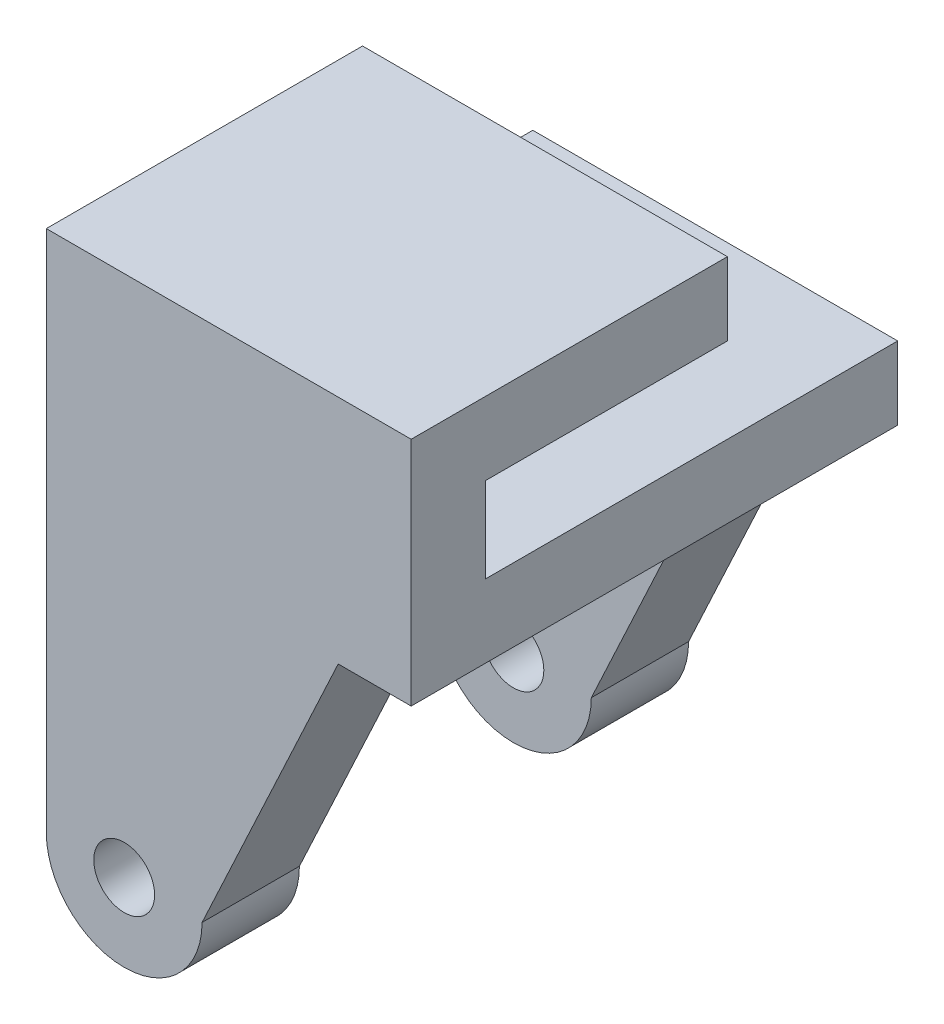
ISO-10303-21;
HEADER;
FILE_DESCRIPTION(('STEP AP214'),'2;1');
FILE_NAME('part.step','',(''),(''),'','','');
FILE_SCHEMA(('AUTOMOTIVE_DESIGN { 1 0 10303 214 1 1 1 1 }'));
ENDSEC;
DATA;
#1=APPLICATION_CONTEXT('core data for automotive mechanical design processes');
#2=APPLICATION_PROTOCOL_DEFINITION('international standard','automotive_design',2000,#1);
#3=PRODUCT_CONTEXT('',#1,'mechanical');
#4=PRODUCT('Part','Part','',(#3));
#5=PRODUCT_RELATED_PRODUCT_CATEGORY('part','',(#4));
#6=PRODUCT_DEFINITION_FORMATION('','',#4);
#7=PRODUCT_DEFINITION_CONTEXT('part definition',#1,'design');
#8=PRODUCT_DEFINITION('design','',#6,#7);
#9=PRODUCT_DEFINITION_SHAPE('','',#8);
#10=(LENGTH_UNIT() NAMED_UNIT(*) SI_UNIT(.MILLI.,.METRE.));
#11=(NAMED_UNIT(*) PLANE_ANGLE_UNIT() SI_UNIT($,.RADIAN.));
#12=(NAMED_UNIT(*) SI_UNIT($,.STERADIAN.) SOLID_ANGLE_UNIT());
#13=UNCERTAINTY_MEASURE_WITH_UNIT(LENGTH_MEASURE(1.E-05),#10,'distance_accuracy_value','');
#14=(GEOMETRIC_REPRESENTATION_CONTEXT(3) GLOBAL_UNCERTAINTY_ASSIGNED_CONTEXT((#13)) GLOBAL_UNIT_ASSIGNED_CONTEXT((#10,
#11,#12)) REPRESENTATION_CONTEXT('',''));
#15=CARTESIAN_POINT('',(0.,0.,0.));
#16=DIRECTION('',(0.,0.,1.));
#17=DIRECTION('',(1.,0.,0.));
#18=AXIS2_PLACEMENT_3D('',#15,#16,#17);
#19=CARTESIAN_POINT('',(15.,0.,0.));
#20=DIRECTION('',(0.,1.,0.));
#21=DIRECTION('',(0.,0.,1.));
#22=AXIS2_PLACEMENT_3D('',#19,#20,#21);
#23=PLANE('',#22);
#24=DIRECTION('',(-1.,0.,0.));
#25=VECTOR('',#24,1.);
#26=CARTESIAN_POINT('',(0.,0.,-16.));
#27=LINE('',#26,#25);
#28=CARTESIAN_POINT('',(12.,0.,-16.));
#29=VERTEX_POINT('',#28);
#30=CARTESIAN_POINT('',(0.,0.,-16.));
#31=VERTEX_POINT('',#30);
#32=EDGE_CURVE('E57',#29,#31,#27,.T.);
#33=ORIENTED_EDGE('',*,*,#32,.F.);
#34=DIRECTION('',(0.,0.,-1.));
#35=VECTOR('',#34,1.);
#36=CARTESIAN_POINT('',(12.,0.,-16.));
#37=LINE('',#36,#35);
#38=CARTESIAN_POINT('',(12.,0.,-20.));
#39=VERTEX_POINT('',#38);
#40=EDGE_CURVE('E62',#29,#39,#37,.T.);
#41=ORIENTED_EDGE('',*,*,#40,.T.);
#42=DIRECTION('',(-1.,0.,0.));
#43=VECTOR('',#42,1.);
#44=CARTESIAN_POINT('',(15.,0.,-20.));
#45=LINE('',#44,#43);
#46=CARTESIAN_POINT('',(15.,0.,-20.));
#47=VERTEX_POINT('',#46);
#48=EDGE_CURVE('E49',#47,#39,#45,.T.);
#49=ORIENTED_EDGE('',*,*,#48,.F.);
#50=DIRECTION('',(0.,0.,-1.));
#51=VECTOR('',#50,1.);
#52=CARTESIAN_POINT('',(15.,0.,0.));
#53=LINE('',#52,#51);
#54=CARTESIAN_POINT('',(15.,0.,0.));
#55=VERTEX_POINT('',#54);
#56=EDGE_CURVE('E292',#55,#47,#53,.T.);
#57=ORIENTED_EDGE('',*,*,#56,.F.);
#58=DIRECTION('',(-1.,0.,0.));
#59=VECTOR('',#58,1.);
#60=CARTESIAN_POINT('',(15.,0.,0.));
#61=LINE('',#60,#59);
#62=CARTESIAN_POINT('',(12.,0.,0.));
#63=VERTEX_POINT('',#62);
#64=EDGE_CURVE('E11',#55,#63,#61,.T.);
#65=ORIENTED_EDGE('',*,*,#64,.T.);
#66=DIRECTION('',(0.,0.,1.));
#67=VECTOR('',#66,1.);
#68=CARTESIAN_POINT('',(12.,0.,-4.));
#69=LINE('',#68,#67);
#70=CARTESIAN_POINT('',(12.,0.,-4.));
#71=VERTEX_POINT('',#70);
#72=EDGE_CURVE('E218',#71,#63,#69,.T.);
#73=ORIENTED_EDGE('',*,*,#72,.F.);
#74=DIRECTION('',(-1.,0.,0.));
#75=VECTOR('',#74,1.);
#76=CARTESIAN_POINT('',(0.,0.,-4.));
#77=LINE('',#76,#75);
#78=CARTESIAN_POINT('',(0.,0.,-4.));
#79=VERTEX_POINT('',#78);
#80=EDGE_CURVE('E194',#71,#79,#77,.T.);
#81=ORIENTED_EDGE('',*,*,#80,.T.);
#82=DIRECTION('',(0.,0.,-1.));
#83=VECTOR('',#82,1.);
#84=CARTESIAN_POINT('',(0.,0.,0.));
#85=LINE('',#84,#83);
#86=EDGE_CURVE('E284',#79,#31,#85,.T.);
#87=ORIENTED_EDGE('',*,*,#86,.T.);
#88=EDGE_LOOP('',(#33,#41,#49,#57,#65,#73,#81,#87));
#89=FACE_BOUND('',#88,.T.);
#90=ADVANCED_FACE('F39',(#89),#23,.F.);
#91=CARTESIAN_POINT('',(15.,0.,0.));
#92=DIRECTION('',(0.,0.,1.));
#93=DIRECTION('',(1.,0.,0.));
#94=AXIS2_PLACEMENT_3D('',#91,#92,#93);
#95=PLANE('',#94);
#96=DIRECTION('',(0.,1.,0.));
#97=VECTOR('',#96,1.);
#98=CARTESIAN_POINT('',(0.,0.,0.));
#99=LINE('',#98,#97);
#100=CARTESIAN_POINT('',(0.,-12.,0.));
#101=VERTEX_POINT('',#100);
#102=CARTESIAN_POINT('',(0.,9.5,0.));
#103=VERTEX_POINT('',#102);
#104=EDGE_CURVE('E278',#101,#103,#99,.T.);
#105=ORIENTED_EDGE('',*,*,#104,.F.);
#106=CARTESIAN_POINT('',(3.20215405107003,-12.,0.));
#107=DIRECTION('',(0.,0.,1.));
#108=DIRECTION('',(1.,0.,0.));
#109=AXIS2_PLACEMENT_3D('',#106,#107,#108);
#110=CIRCLE('',#109,3.20215405107003);
#111=CARTESIAN_POINT('',(6.40430810214006,-12.,0.));
#112=VERTEX_POINT('',#111);
#113=EDGE_CURVE('E190',#101,#112,#110,.T.);
#114=ORIENTED_EDGE('',*,*,#113,.T.);
#115=DIRECTION('',(0.422618261740696,0.906307787036651,0.));
#116=VECTOR('',#115,1.);
#117=CARTESIAN_POINT('',(12.,0.,0.));
#118=LINE('',#117,#116);
#119=EDGE_CURVE('E199',#112,#63,#118,.T.);
#120=ORIENTED_EDGE('',*,*,#119,.T.);
#121=ORIENTED_EDGE('',*,*,#64,.F.);
#122=DIRECTION('',(0.,1.,0.));
#123=VECTOR('',#122,1.);
#124=CARTESIAN_POINT('',(15.,0.,0.));
#125=LINE('',#124,#123);
#126=CARTESIAN_POINT('',(15.,9.5,0.));
#127=VERTEX_POINT('',#126);
#128=EDGE_CURVE('E279',#55,#127,#125,.T.);
#129=ORIENTED_EDGE('',*,*,#128,.T.);
#130=DIRECTION('',(-1.,0.,0.));
#131=VECTOR('',#130,1.);
#132=CARTESIAN_POINT('',(15.,9.5,0.));
#133=LINE('',#132,#131);
#134=EDGE_CURVE('E43',#127,#103,#133,.T.);
#135=ORIENTED_EDGE('',*,*,#134,.T.);
#136=EDGE_LOOP('',(#105,#114,#120,#121,#129,#135));
#137=FACE_BOUND('',#136,.T.);
#138=CARTESIAN_POINT('',(3.20215405107003,-12.,0.));
#139=DIRECTION('',(0.,0.,1.));
#140=DIRECTION('',(1.,0.,0.));
#141=AXIS2_PLACEMENT_3D('',#138,#139,#140);
#142=CIRCLE('',#141,1.25);
#143=CARTESIAN_POINT('',(4.45215405107003,-12.,0.));
#144=VERTEX_POINT('',#143);
#145=EDGE_CURVE('E182',#144,#144,#142,.T.);
#146=ORIENTED_EDGE('',*,*,#145,.F.);
#147=EDGE_LOOP('',(#146));
#148=FACE_BOUND('',#147,.T.);
#149=ADVANCED_FACE('F41',(#137,#148),#95,.T.);
#150=CARTESIAN_POINT('',(15.,0.,-20.));
#151=DIRECTION('',(0.,0.,1.));
#152=DIRECTION('',(1.,0.,0.));
#153=AXIS2_PLACEMENT_3D('',#150,#151,#152);
#154=PLANE('',#153);
#155=DIRECTION('',(0.,1.,0.));
#156=VECTOR('',#155,1.);
#157=CARTESIAN_POINT('',(0.,0.,-20.));
#158=LINE('',#157,#156);
#159=CARTESIAN_POINT('',(0.,-12.,-20.));
#160=VERTEX_POINT('',#159);
#161=CARTESIAN_POINT('',(0.,3.,-20.));
#162=VERTEX_POINT('',#161);
#163=EDGE_CURVE('E302',#160,#162,#158,.T.);
#164=ORIENTED_EDGE('',*,*,#163,.T.);
#165=DIRECTION('',(1.,0.,0.));
#166=VECTOR('',#165,1.);
#167=CARTESIAN_POINT('',(0.,3.,-20.));
#168=LINE('',#167,#166);
#169=CARTESIAN_POINT('',(15.,3.,-20.));
#170=VERTEX_POINT('',#169);
#171=EDGE_CURVE('E244',#162,#170,#168,.T.);
#172=ORIENTED_EDGE('',*,*,#171,.T.);
#173=DIRECTION('',(0.,1.,0.));
#174=VECTOR('',#173,1.);
#175=CARTESIAN_POINT('',(15.,0.,-20.));
#176=LINE('',#175,#174);
#177=EDGE_CURVE('E288',#47,#170,#176,.T.);
#178=ORIENTED_EDGE('',*,*,#177,.F.);
#179=ORIENTED_EDGE('',*,*,#48,.T.);
#180=DIRECTION('',(0.422618261740696,0.906307787036651,0.));
#181=VECTOR('',#180,1.);
#182=CARTESIAN_POINT('',(12.,0.,-20.));
#183=LINE('',#182,#181);
#184=CARTESIAN_POINT('',(6.40430810214006,-12.,-20.));
#185=VERTEX_POINT('',#184);
#186=EDGE_CURVE('E175',#185,#39,#183,.T.);
#187=ORIENTED_EDGE('',*,*,#186,.F.);
#188=CARTESIAN_POINT('',(3.20215405107003,-12.,-20.));
#189=DIRECTION('',(0.,0.,1.));
#190=DIRECTION('',(1.,0.,0.));
#191=AXIS2_PLACEMENT_3D('',#188,#189,#190);
#192=CIRCLE('',#191,3.20215405107003);
#193=EDGE_CURVE('E159',#160,#185,#192,.T.);
#194=ORIENTED_EDGE('',*,*,#193,.F.);
#195=EDGE_LOOP('',(#164,#172,#178,#179,#187,#194));
#196=FACE_BOUND('',#195,.T.);
#197=CARTESIAN_POINT('',(3.20215405107003,-12.,-20.));
#198=DIRECTION('',(0.,0.,1.));
#199=DIRECTION('',(1.,0.,0.));
#200=AXIS2_PLACEMENT_3D('',#197,#198,#199);
#201=CIRCLE('',#200,1.25);
#202=CARTESIAN_POINT('',(4.45215405107003,-12.,-20.));
#203=VERTEX_POINT('',#202);
#204=EDGE_CURVE('E351',#203,#203,#201,.T.);
#205=ORIENTED_EDGE('',*,*,#204,.T.);
#206=EDGE_LOOP('',(#205));
#207=FACE_BOUND('',#206,.T.);
#208=ADVANCED_FACE('F345',(#196,#207),#154,.F.);
#209=CARTESIAN_POINT('',(15.,9.5,0.));
#210=DIRECTION('',(0.,1.,0.));
#211=DIRECTION('',(0.,0.,1.));
#212=AXIS2_PLACEMENT_3D('',#209,#210,#211);
#213=PLANE('',#212);
#214=DIRECTION('',(1.,0.,0.));
#215=VECTOR('',#214,1.);
#216=CARTESIAN_POINT('',(0.,9.5,-13.));
#217=LINE('',#216,#215);
#218=CARTESIAN_POINT('',(0.,9.5,-13.));
#219=VERTEX_POINT('',#218);
#220=CARTESIAN_POINT('',(15.,9.5,-13.));
#221=VERTEX_POINT('',#220);
#222=EDGE_CURVE('E243',#219,#221,#217,.T.);
#223=ORIENTED_EDGE('',*,*,#222,.F.);
#224=DIRECTION('',(0.,0.,-1.));
#225=VECTOR('',#224,1.);
#226=CARTESIAN_POINT('',(0.,9.5,0.));
#227=LINE('',#226,#225);
#228=EDGE_CURVE('E298',#103,#219,#227,.T.);
#229=ORIENTED_EDGE('',*,*,#228,.F.);
#230=ORIENTED_EDGE('',*,*,#134,.F.);
#231=DIRECTION('',(0.,0.,-1.));
#232=VECTOR('',#231,1.);
#233=CARTESIAN_POINT('',(15.,9.5,0.));
#234=LINE('',#233,#232);
#235=EDGE_CURVE('E283',#127,#221,#234,.T.);
#236=ORIENTED_EDGE('',*,*,#235,.T.);
#237=EDGE_LOOP('',(#223,#229,#230,#236));
#238=FACE_BOUND('',#237,.T.);
#239=ADVANCED_FACE('F318',(#238),#213,.T.);
#240=CARTESIAN_POINT('',(15.,0.,0.));
#241=DIRECTION('',(-1.,0.,0.));
#242=DIRECTION('',(0.,0.,1.));
#243=AXIS2_PLACEMENT_3D('',#240,#241,#242);
#244=PLANE('',#243);
#245=ORIENTED_EDGE('',*,*,#177,.T.);
#246=DIRECTION('',(0.,0.,1.));
#247=VECTOR('',#246,1.);
#248=CARTESIAN_POINT('',(15.,3.,0.));
#249=LINE('',#248,#247);
#250=CARTESIAN_POINT('',(15.,3.,-3.04752099116994));
#251=VERTEX_POINT('',#250);
#252=EDGE_CURVE('E274',#170,#251,#249,.T.);
#253=ORIENTED_EDGE('',*,*,#252,.T.);
#254=DIRECTION('',(0.,1.,0.));
#255=VECTOR('',#254,1.);
#256=CARTESIAN_POINT('',(15.,0.,-3.04752099116994));
#257=LINE('',#256,#255);
#258=CARTESIAN_POINT('',(15.,6.5,-3.04752099116994));
#259=VERTEX_POINT('',#258);
#260=EDGE_CURVE('E270',#251,#259,#257,.T.);
#261=ORIENTED_EDGE('',*,*,#260,.T.);
#262=DIRECTION('',(0.,0.,-1.));
#263=VECTOR('',#262,1.);
#264=CARTESIAN_POINT('',(15.,6.5,0.));
#265=LINE('',#264,#263);
#266=CARTESIAN_POINT('',(15.,6.5,-13.));
#267=VERTEX_POINT('',#266);
#268=EDGE_CURVE('E266',#259,#267,#265,.T.);
#269=ORIENTED_EDGE('',*,*,#268,.T.);
#270=DIRECTION('',(0.,1.,0.));
#271=VECTOR('',#270,1.);
#272=CARTESIAN_POINT('',(15.,0.,-13.));
#273=LINE('',#272,#271);
#274=EDGE_CURVE('E248',#267,#221,#273,.T.);
#275=ORIENTED_EDGE('',*,*,#274,.T.);
#276=ORIENTED_EDGE('',*,*,#235,.F.);
#277=ORIENTED_EDGE('',*,*,#128,.F.);
#278=ORIENTED_EDGE('',*,*,#56,.T.);
#279=EDGE_LOOP('',(#245,#253,#261,#269,#275,#276,#277,#278));
#280=FACE_BOUND('',#279,.T.);
#281=ADVANCED_FACE('F333',(#280),#244,.F.);
#282=CARTESIAN_POINT('',(0.,0.,0.));
#283=DIRECTION('',(-1.,0.,0.));
#284=DIRECTION('',(0.,0.,1.));
#285=AXIS2_PLACEMENT_3D('',#282,#283,#284);
#286=PLANE('',#285);
#287=DIRECTION('',(0.,0.,-1.));
#288=VECTOR('',#287,1.);
#289=CARTESIAN_POINT('',(0.,3.,-20.));
#290=LINE('',#289,#288);
#291=CARTESIAN_POINT('',(0.,3.,-3.04752099116994));
#292=VERTEX_POINT('',#291);
#293=EDGE_CURVE('E239',#292,#162,#290,.T.);
#294=ORIENTED_EDGE('',*,*,#293,.T.);
#295=ORIENTED_EDGE('',*,*,#163,.F.);
#296=DIRECTION('',(0.,0.,-1.));
#297=VECTOR('',#296,1.);
#298=CARTESIAN_POINT('',(0.,-12.,-16.));
#299=LINE('',#298,#297);
#300=CARTESIAN_POINT('',(0.,-12.,-16.));
#301=VERTEX_POINT('',#300);
#302=EDGE_CURVE('E164',#301,#160,#299,.T.);
#303=ORIENTED_EDGE('',*,*,#302,.F.);
#304=DIRECTION('',(0.,-1.,0.));
#305=VECTOR('',#304,1.);
#306=CARTESIAN_POINT('',(0.,0.,-16.));
#307=LINE('',#306,#305);
#308=EDGE_CURVE('E149',#31,#301,#307,.T.);
#309=ORIENTED_EDGE('',*,*,#308,.F.);
#310=ORIENTED_EDGE('',*,*,#86,.F.);
#311=DIRECTION('',(0.,-1.,0.));
#312=VECTOR('',#311,1.);
#313=CARTESIAN_POINT('',(0.,0.,-4.));
#314=LINE('',#313,#312);
#315=CARTESIAN_POINT('',(0.,-12.,-4.));
#316=VERTEX_POINT('',#315);
#317=EDGE_CURVE('E198',#79,#316,#314,.T.);
#318=ORIENTED_EDGE('',*,*,#317,.T.);
#319=DIRECTION('',(0.,0.,1.));
#320=VECTOR('',#319,1.);
#321=CARTESIAN_POINT('',(0.,-12.,-4.));
#322=LINE('',#321,#320);
#323=EDGE_CURVE('E211',#316,#101,#322,.T.);
#324=ORIENTED_EDGE('',*,*,#323,.T.);
#325=ORIENTED_EDGE('',*,*,#104,.T.);
#326=ORIENTED_EDGE('',*,*,#228,.T.);
#327=DIRECTION('',(0.,-1.,0.));
#328=VECTOR('',#327,1.);
#329=CARTESIAN_POINT('',(0.,6.5,-13.));
#330=LINE('',#329,#328);
#331=CARTESIAN_POINT('',(0.,6.5,-13.));
#332=VERTEX_POINT('',#331);
#333=EDGE_CURVE('E221',#219,#332,#330,.T.);
#334=ORIENTED_EDGE('',*,*,#333,.T.);
#335=DIRECTION('',(0.,0.,1.));
#336=VECTOR('',#335,1.);
#337=CARTESIAN_POINT('',(0.,6.5,-13.));
#338=LINE('',#337,#336);
#339=CARTESIAN_POINT('',(0.,6.5,-3.04752099116994));
#340=VERTEX_POINT('',#339);
#341=EDGE_CURVE('E231',#332,#340,#338,.T.);
#342=ORIENTED_EDGE('',*,*,#341,.T.);
#343=DIRECTION('',(0.,-1.,0.));
#344=VECTOR('',#343,1.);
#345=CARTESIAN_POINT('',(0.,3.,-3.04752099116994));
#346=LINE('',#345,#344);
#347=EDGE_CURVE('E235',#340,#292,#346,.T.);
#348=ORIENTED_EDGE('',*,*,#347,.T.);
#349=EDGE_LOOP('',(#294,#295,#303,#309,#310,#318,#324,#325,#326,#334,#342,#348));
#350=FACE_BOUND('',#349,.T.);
#351=ADVANCED_FACE('F320',(#350),#286,.T.);
#352=CARTESIAN_POINT('',(0.,3.,-20.));
#353=DIRECTION('',(0.,-1.,0.));
#354=DIRECTION('',(0.,0.,-1.));
#355=AXIS2_PLACEMENT_3D('',#352,#353,#354);
#356=PLANE('',#355);
#357=ORIENTED_EDGE('',*,*,#171,.F.);
#358=ORIENTED_EDGE('',*,*,#293,.F.);
#359=DIRECTION('',(1.,0.,0.));
#360=VECTOR('',#359,1.);
#361=CARTESIAN_POINT('',(0.,3.,-3.04752099116994));
#362=LINE('',#361,#360);
#363=EDGE_CURVE('E249',#292,#251,#362,.T.);
#364=ORIENTED_EDGE('',*,*,#363,.T.);
#365=ORIENTED_EDGE('',*,*,#252,.F.);
#366=EDGE_LOOP('',(#357,#358,#364,#365));
#367=FACE_BOUND('',#366,.T.);
#368=ADVANCED_FACE('F344',(#367),#356,.F.);
#369=CARTESIAN_POINT('',(0.,3.,-3.04752099116994));
#370=DIRECTION('',(0.,0.,1.));
#371=DIRECTION('',(0.,-1.,0.));
#372=AXIS2_PLACEMENT_3D('',#369,#370,#371);
#373=PLANE('',#372);
#374=ORIENTED_EDGE('',*,*,#363,.F.);
#375=ORIENTED_EDGE('',*,*,#347,.F.);
#376=DIRECTION('',(1.,0.,0.));
#377=VECTOR('',#376,1.);
#378=CARTESIAN_POINT('',(0.,6.5,-3.04752099116994));
#379=LINE('',#378,#377);
#380=EDGE_CURVE('E253',#340,#259,#379,.T.);
#381=ORIENTED_EDGE('',*,*,#380,.T.);
#382=ORIENTED_EDGE('',*,*,#260,.F.);
#383=EDGE_LOOP('',(#374,#375,#381,#382));
#384=FACE_BOUND('',#383,.T.);
#385=ADVANCED_FACE('F342',(#384),#373,.F.);
#386=CARTESIAN_POINT('',(0.,6.5,-13.));
#387=DIRECTION('',(0.,1.,0.));
#388=DIRECTION('',(0.,0.,1.));
#389=AXIS2_PLACEMENT_3D('',#386,#387,#388);
#390=PLANE('',#389);
#391=ORIENTED_EDGE('',*,*,#380,.F.);
#392=ORIENTED_EDGE('',*,*,#341,.F.);
#393=DIRECTION('',(1.,0.,0.));
#394=VECTOR('',#393,1.);
#395=CARTESIAN_POINT('',(0.,6.5,-13.));
#396=LINE('',#395,#394);
#397=EDGE_CURVE('E257',#332,#267,#396,.T.);
#398=ORIENTED_EDGE('',*,*,#397,.T.);
#399=ORIENTED_EDGE('',*,*,#268,.F.);
#400=EDGE_LOOP('',(#391,#392,#398,#399));
#401=FACE_BOUND('',#400,.T.);
#402=ADVANCED_FACE('F338',(#401),#390,.F.);
#403=CARTESIAN_POINT('',(0.,6.5,-13.));
#404=DIRECTION('',(0.,0.,1.));
#405=DIRECTION('',(1.,0.,0.));
#406=AXIS2_PLACEMENT_3D('',#403,#404,#405);
#407=PLANE('',#406);
#408=ORIENTED_EDGE('',*,*,#397,.F.);
#409=ORIENTED_EDGE('',*,*,#333,.F.);
#410=ORIENTED_EDGE('',*,*,#222,.T.);
#411=ORIENTED_EDGE('',*,*,#274,.F.);
#412=EDGE_LOOP('',(#408,#409,#410,#411));
#413=FACE_BOUND('',#412,.T.);
#414=ADVANCED_FACE('F336',(#413),#407,.F.);
#415=CARTESIAN_POINT('',(12.,0.,-4.));
#416=DIRECTION('',(0.906307787036651,-0.422618261740696,0.));
#417=DIRECTION('',(0.422618261740697,0.906307787036651,0.));
#418=AXIS2_PLACEMENT_3D('',#415,#416,#417);
#419=PLANE('',#418);
#420=ORIENTED_EDGE('',*,*,#119,.F.);
#421=DIRECTION('',(0.,0.,1.));
#422=VECTOR('',#421,1.);
#423=CARTESIAN_POINT('',(6.40430810214006,-12.,-4.));
#424=LINE('',#423,#422);
#425=CARTESIAN_POINT('',(6.40430810214006,-12.,-4.));
#426=VERTEX_POINT('',#425);
#427=EDGE_CURVE('E222',#426,#112,#424,.T.);
#428=ORIENTED_EDGE('',*,*,#427,.F.);
#429=DIRECTION('',(0.422618261740696,0.906307787036651,0.));
#430=VECTOR('',#429,1.);
#431=CARTESIAN_POINT('',(12.,0.,-4.));
#432=LINE('',#431,#430);
#433=EDGE_CURVE('E207',#426,#71,#432,.T.);
#434=ORIENTED_EDGE('',*,*,#433,.T.);
#435=ORIENTED_EDGE('',*,*,#72,.T.);
#436=EDGE_LOOP('',(#420,#428,#434,#435));
#437=FACE_BOUND('',#436,.T.);
#438=ADVANCED_FACE('F328',(#437),#419,.T.);
#439=CARTESIAN_POINT('',(3.20215405107003,-12.,-4.));
#440=DIRECTION('',(0.,0.,1.));
#441=DIRECTION('',(1.,0.,0.));
#442=AXIS2_PLACEMENT_3D('',#439,#440,#441);
#443=CYLINDRICAL_SURFACE('',#442,3.20215405107003);
#444=ORIENTED_EDGE('',*,*,#113,.F.);
#445=ORIENTED_EDGE('',*,*,#323,.F.);
#446=CARTESIAN_POINT('',(3.20215405107003,-12.,-4.));
#447=DIRECTION('',(0.,0.,1.));
#448=DIRECTION('',(1.,0.,0.));
#449=AXIS2_PLACEMENT_3D('',#446,#447,#448);
#450=CIRCLE('',#449,3.20215405107003);
#451=EDGE_CURVE('E203',#316,#426,#450,.T.);
#452=ORIENTED_EDGE('',*,*,#451,.T.);
#453=ORIENTED_EDGE('',*,*,#427,.T.);
#454=EDGE_LOOP('',(#444,#445,#452,#453));
#455=FACE_BOUND('',#454,.T.);
#456=ADVANCED_FACE('F325',(#455),#443,.T.);
#457=CARTESIAN_POINT('',(3.20215405107003,-12.,-4.));
#458=DIRECTION('',(0.,0.,1.));
#459=DIRECTION('',(1.,0.,0.));
#460=AXIS2_PLACEMENT_3D('',#457,#458,#459);
#461=PLANE('',#460);
#462=CARTESIAN_POINT('',(3.20215405107003,-12.,-4.));
#463=DIRECTION('',(0.,0.,1.));
#464=DIRECTION('',(1.,0.,0.));
#465=AXIS2_PLACEMENT_3D('',#462,#463,#464);
#466=CIRCLE('',#465,1.25);
#467=CARTESIAN_POINT('',(4.45215405107003,-12.,-4.));
#468=VERTEX_POINT('',#467);
#469=EDGE_CURVE('E186',#468,#468,#466,.T.);
#470=ORIENTED_EDGE('',*,*,#469,.T.);
#471=EDGE_LOOP('',(#470));
#472=FACE_BOUND('',#471,.T.);
#473=ORIENTED_EDGE('',*,*,#80,.F.);
#474=ORIENTED_EDGE('',*,*,#433,.F.);
#475=ORIENTED_EDGE('',*,*,#451,.F.);
#476=ORIENTED_EDGE('',*,*,#317,.F.);
#477=EDGE_LOOP('',(#473,#474,#475,#476));
#478=FACE_BOUND('',#477,.T.);
#479=ADVANCED_FACE('F368',(#472,#478),#461,.F.);
#480=CARTESIAN_POINT('',(3.20215405107003,-12.,-4.));
#481=DIRECTION('',(0.,0.,1.));
#482=DIRECTION('',(1.,0.,0.));
#483=AXIS2_PLACEMENT_3D('',#480,#481,#482);
#484=CYLINDRICAL_SURFACE('',#483,1.25);
#485=ORIENTED_EDGE('',*,*,#469,.F.);
#486=EDGE_LOOP('',(#485));
#487=FACE_BOUND('',#486,.T.);
#488=ORIENTED_EDGE('',*,*,#145,.T.);
#489=EDGE_LOOP('',(#488));
#490=FACE_BOUND('',#489,.T.);
#491=ADVANCED_FACE('F361',(#487,#490),#484,.F.);
#492=CARTESIAN_POINT('',(3.20215405107003,-12.,-16.));
#493=DIRECTION('',(0.,0.,-1.));
#494=DIRECTION('',(1.,0.,0.));
#495=AXIS2_PLACEMENT_3D('',#492,#493,#494);
#496=PLANE('',#495);
#497=ORIENTED_EDGE('',*,*,#32,.T.);
#498=ORIENTED_EDGE('',*,*,#308,.T.);
#499=CARTESIAN_POINT('',(3.20215405107003,-12.,-16.));
#500=DIRECTION('',(0.,0.,1.));
#501=DIRECTION('',(1.,0.,0.));
#502=AXIS2_PLACEMENT_3D('',#499,#500,#501);
#503=CIRCLE('',#502,3.20215405107003);
#504=CARTESIAN_POINT('',(6.40430810214006,-12.,-16.));
#505=VERTEX_POINT('',#504);
#506=EDGE_CURVE('E142',#301,#505,#503,.T.);
#507=ORIENTED_EDGE('',*,*,#506,.T.);
#508=DIRECTION('',(0.422618261740696,0.906307787036651,0.));
#509=VECTOR('',#508,1.);
#510=CARTESIAN_POINT('',(12.,0.,-16.));
#511=LINE('',#510,#509);
#512=EDGE_CURVE('E147',#505,#29,#511,.T.);
#513=ORIENTED_EDGE('',*,*,#512,.T.);
#514=EDGE_LOOP('',(#497,#498,#507,#513));
#515=FACE_BOUND('',#514,.T.);
#516=CARTESIAN_POINT('',(3.20215405107003,-12.,-16.));
#517=DIRECTION('',(0.,0.,1.));
#518=DIRECTION('',(1.,0.,0.));
#519=AXIS2_PLACEMENT_3D('',#516,#517,#518);
#520=CIRCLE('',#519,1.25);
#521=CARTESIAN_POINT('',(4.45215405107003,-12.,-16.));
#522=VERTEX_POINT('',#521);
#523=EDGE_CURVE('E178',#522,#522,#520,.T.);
#524=ORIENTED_EDGE('',*,*,#523,.F.);
#525=EDGE_LOOP('',(#524));
#526=FACE_BOUND('',#525,.T.);
#527=ADVANCED_FACE('F144',(#515,#526),#496,.F.);
#528=CARTESIAN_POINT('',(3.20215405107003,-12.,-16.));
#529=DIRECTION('',(0.,0.,-1.));
#530=DIRECTION('',(-1.,0.,0.));
#531=AXIS2_PLACEMENT_3D('',#528,#529,#530);
#532=CYLINDRICAL_SURFACE('',#531,3.20215405107003);
#533=ORIENTED_EDGE('',*,*,#193,.T.);
#534=DIRECTION('',(0.,0.,-1.));
#535=VECTOR('',#534,1.);
#536=CARTESIAN_POINT('',(6.40430810214006,-12.,-16.));
#537=LINE('',#536,#535);
#538=EDGE_CURVE('E156',#505,#185,#537,.T.);
#539=ORIENTED_EDGE('',*,*,#538,.F.);
#540=ORIENTED_EDGE('',*,*,#506,.F.);
#541=ORIENTED_EDGE('',*,*,#302,.T.);
#542=EDGE_LOOP('',(#533,#539,#540,#541));
#543=FACE_BOUND('',#542,.T.);
#544=ADVANCED_FACE('F157',(#543),#532,.T.);
#545=CARTESIAN_POINT('',(12.,0.,-16.));
#546=DIRECTION('',(-0.906307787036651,0.422618261740696,0.));
#547=DIRECTION('',(-0.422618261740697,-0.906307787036651,0.));
#548=AXIS2_PLACEMENT_3D('',#545,#546,#547);
#549=PLANE('',#548);
#550=ORIENTED_EDGE('',*,*,#186,.T.);
#551=ORIENTED_EDGE('',*,*,#40,.F.);
#552=ORIENTED_EDGE('',*,*,#512,.F.);
#553=ORIENTED_EDGE('',*,*,#538,.T.);
#554=EDGE_LOOP('',(#550,#551,#552,#553));
#555=FACE_BOUND('',#554,.T.);
#556=ADVANCED_FACE('F166',(#555),#549,.F.);
#557=CARTESIAN_POINT('',(3.20215405107003,-12.,-16.));
#558=DIRECTION('',(0.,0.,-1.));
#559=DIRECTION('',(-1.,0.,0.));
#560=AXIS2_PLACEMENT_3D('',#557,#558,#559);
#561=CYLINDRICAL_SURFACE('',#560,1.25);
#562=ORIENTED_EDGE('',*,*,#523,.T.);
#563=EDGE_LOOP('',(#562));
#564=FACE_BOUND('',#563,.T.);
#565=ORIENTED_EDGE('',*,*,#204,.F.);
#566=EDGE_LOOP('',(#565));
#567=FACE_BOUND('',#566,.T.);
#568=ADVANCED_FACE('F359',(#564,#567),#561,.F.);
#569=CLOSED_SHELL('',(#90,#149,#208,#239,#281,#351,#368,#385,#402,#414,#438,#456,#479,#491,#527,
#544,#556,#568));
#570=MANIFOLD_SOLID_BREP('B2',#569);
#571=ADVANCED_BREP_SHAPE_REPRESENTATION('',(#18,#570),#14);
#572=SHAPE_DEFINITION_REPRESENTATION(#9,#571);
ENDSEC;
END-ISO-10303-21;
